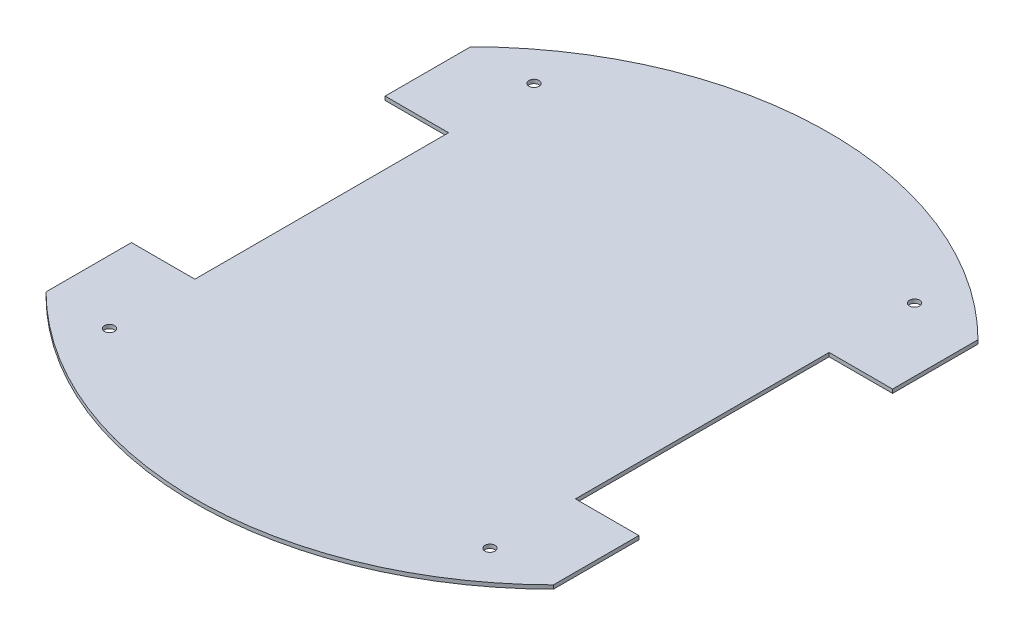
ISO-10303-21;
HEADER;
FILE_DESCRIPTION(('STEP AP214'),'2;1');
FILE_NAME('part.step','',(''),(''),'','','');
FILE_SCHEMA(('AUTOMOTIVE_DESIGN { 1 0 10303 214 1 1 1 1 }'));
ENDSEC;
DATA;
#1=APPLICATION_CONTEXT('core data for automotive mechanical design processes');
#2=APPLICATION_PROTOCOL_DEFINITION('international standard','automotive_design',2000,#1);
#3=PRODUCT_CONTEXT('',#1,'mechanical');
#4=PRODUCT('Part','Part','',(#3));
#5=PRODUCT_RELATED_PRODUCT_CATEGORY('part','',(#4));
#6=PRODUCT_DEFINITION_FORMATION('','',#4);
#7=PRODUCT_DEFINITION_CONTEXT('part definition',#1,'design');
#8=PRODUCT_DEFINITION('design','',#6,#7);
#9=PRODUCT_DEFINITION_SHAPE('','',#8);
#10=(LENGTH_UNIT() NAMED_UNIT(*) SI_UNIT(.MILLI.,.METRE.));
#11=(NAMED_UNIT(*) PLANE_ANGLE_UNIT() SI_UNIT($,.RADIAN.));
#12=(NAMED_UNIT(*) SI_UNIT($,.STERADIAN.) SOLID_ANGLE_UNIT());
#13=UNCERTAINTY_MEASURE_WITH_UNIT(LENGTH_MEASURE(1.E-05),#10,'distance_accuracy_value','');
#14=(GEOMETRIC_REPRESENTATION_CONTEXT(3) GLOBAL_UNCERTAINTY_ASSIGNED_CONTEXT((#13)) GLOBAL_UNIT_ASSIGNED_CONTEXT((#10,
#11,#12)) REPRESENTATION_CONTEXT('',''));
#15=CARTESIAN_POINT('',(0.,0.,0.));
#16=DIRECTION('',(0.,0.,1.));
#17=DIRECTION('',(1.,0.,0.));
#18=AXIS2_PLACEMENT_3D('',#15,#16,#17);
#19=CARTESIAN_POINT('',(-150.,3.,100.));
#20=DIRECTION('',(0.,0.,1.));
#21=DIRECTION('',(1.,0.,0.));
#22=AXIS2_PLACEMENT_3D('',#19,#20,#21);
#23=PLANE('',#22);
#24=DIRECTION('',(-1.,0.,0.));
#25=VECTOR('',#24,1.);
#26=CARTESIAN_POINT('',(-150.,0.,100.));
#27=LINE('',#26,#25);
#28=CARTESIAN_POINT('',(-150.,0.,100.));
#29=VERTEX_POINT('',#28);
#30=CARTESIAN_POINT('',(-200.,0.,100.));
#31=VERTEX_POINT('',#30);
#32=EDGE_CURVE('E154',#29,#31,#27,.T.);
#33=ORIENTED_EDGE('',*,*,#32,.T.);
#34=DIRECTION('',(0.,-1.,0.));
#35=VECTOR('',#34,1.);
#36=CARTESIAN_POINT('',(-200.,3.,100.));
#37=LINE('',#36,#35);
#38=CARTESIAN_POINT('',(-200.,3.,100.));
#39=VERTEX_POINT('',#38);
#40=EDGE_CURVE('E11',#39,#31,#37,.T.);
#41=ORIENTED_EDGE('',*,*,#40,.F.);
#42=DIRECTION('',(-1.,0.,0.));
#43=VECTOR('',#42,1.);
#44=CARTESIAN_POINT('',(-150.,3.,100.));
#45=LINE('',#44,#43);
#46=CARTESIAN_POINT('',(-150.,3.,100.));
#47=VERTEX_POINT('',#46);
#48=EDGE_CURVE('E176',#47,#39,#45,.T.);
#49=ORIENTED_EDGE('',*,*,#48,.F.);
#50=DIRECTION('',(0.,-1.,0.));
#51=VECTOR('',#50,1.);
#52=CARTESIAN_POINT('',(-150.,3.,100.));
#53=LINE('',#52,#51);
#54=EDGE_CURVE('E150',#47,#29,#53,.T.);
#55=ORIENTED_EDGE('',*,*,#54,.T.);
#56=EDGE_LOOP('',(#33,#41,#49,#55));
#57=FACE_BOUND('',#56,.T.);
#58=ADVANCED_FACE('F32',(#57),#23,.F.);
#59=CARTESIAN_POINT('',(-200.,3.,100.));
#60=DIRECTION('',(1.,0.,0.));
#61=DIRECTION('',(0.,0.,-1.));
#62=AXIS2_PLACEMENT_3D('',#59,#60,#61);
#63=PLANE('',#62);
#64=DIRECTION('',(0.,0.,1.));
#65=VECTOR('',#64,1.);
#66=CARTESIAN_POINT('',(-200.,0.,100.));
#67=LINE('',#66,#65);
#68=CARTESIAN_POINT('',(-200.,0.,167.359909646538));
#69=VERTEX_POINT('',#68);
#70=EDGE_CURVE('E157',#31,#69,#67,.T.);
#71=ORIENTED_EDGE('',*,*,#70,.T.);
#72=DIRECTION('',(0.,-1.,0.));
#73=VECTOR('',#72,1.);
#74=CARTESIAN_POINT('',(-200.,3.,167.359909646538));
#75=LINE('',#74,#73);
#76=CARTESIAN_POINT('',(-200.,3.,167.359909646538));
#77=VERTEX_POINT('',#76);
#78=EDGE_CURVE('E41',#77,#69,#75,.T.);
#79=ORIENTED_EDGE('',*,*,#78,.F.);
#80=DIRECTION('',(0.,0.,1.));
#81=VECTOR('',#80,1.);
#82=CARTESIAN_POINT('',(-200.,3.,100.));
#83=LINE('',#82,#81);
#84=EDGE_CURVE('E105',#39,#77,#83,.T.);
#85=ORIENTED_EDGE('',*,*,#84,.F.);
#86=ORIENTED_EDGE('',*,*,#40,.T.);
#87=EDGE_LOOP('',(#71,#79,#85,#86));
#88=FACE_BOUND('',#87,.T.);
#89=ADVANCED_FACE('F229',(#88),#63,.F.);
#90=CARTESIAN_POINT('',(0.,3.,-33.3333333333335));
#91=DIRECTION('',(0.,-1.,0.));
#92=DIRECTION('',(0.,0.,-1.));
#93=AXIS2_PLACEMENT_3D('',#90,#91,#92);
#94=CYLINDRICAL_SURFACE('',#93,283.333333333333);
#95=CARTESIAN_POINT('',(0.,0.,-33.3333333333335));
#96=DIRECTION('',(0.,1.,0.));
#97=DIRECTION('',(0.,0.,1.));
#98=AXIS2_PLACEMENT_3D('',#95,#96,#97);
#99=CIRCLE('',#98,283.333333333333);
#100=CARTESIAN_POINT('',(200.,0.,167.359909646538));
#101=VERTEX_POINT('',#100);
#102=EDGE_CURVE('E159',#69,#101,#99,.T.);
#103=ORIENTED_EDGE('',*,*,#102,.T.);
#104=DIRECTION('',(0.,-1.,0.));
#105=VECTOR('',#104,1.);
#106=CARTESIAN_POINT('',(200.,3.,167.359909646538));
#107=LINE('',#106,#105);
#108=CARTESIAN_POINT('',(200.,3.,167.359909646538));
#109=VERTEX_POINT('',#108);
#110=EDGE_CURVE('E195',#109,#101,#107,.T.);
#111=ORIENTED_EDGE('',*,*,#110,.F.);
#112=CARTESIAN_POINT('',(0.,3.,-33.3333333333335));
#113=DIRECTION('',(0.,1.,0.));
#114=DIRECTION('',(0.,0.,1.));
#115=AXIS2_PLACEMENT_3D('',#112,#113,#114);
#116=CIRCLE('',#115,283.333333333333);
#117=EDGE_CURVE('E244',#77,#109,#116,.T.);
#118=ORIENTED_EDGE('',*,*,#117,.F.);
#119=ORIENTED_EDGE('',*,*,#78,.T.);
#120=EDGE_LOOP('',(#103,#111,#118,#119));
#121=FACE_BOUND('',#120,.T.);
#122=ADVANCED_FACE('F234',(#121),#94,.T.);
#123=CARTESIAN_POINT('',(200.,3.,100.));
#124=DIRECTION('',(-1.,0.,0.));
#125=DIRECTION('',(0.,0.,1.));
#126=AXIS2_PLACEMENT_3D('',#123,#124,#125);
#127=PLANE('',#126);
#128=DIRECTION('',(0.,0.,-1.));
#129=VECTOR('',#128,1.);
#130=CARTESIAN_POINT('',(200.,0.,100.));
#131=LINE('',#130,#129);
#132=CARTESIAN_POINT('',(200.,0.,100.));
#133=VERTEX_POINT('',#132);
#134=EDGE_CURVE('E161',#101,#133,#131,.T.);
#135=ORIENTED_EDGE('',*,*,#134,.T.);
#136=DIRECTION('',(0.,-1.,0.));
#137=VECTOR('',#136,1.);
#138=CARTESIAN_POINT('',(200.,3.,100.));
#139=LINE('',#138,#137);
#140=CARTESIAN_POINT('',(200.,3.,100.));
#141=VERTEX_POINT('',#140);
#142=EDGE_CURVE('E192',#141,#133,#139,.T.);
#143=ORIENTED_EDGE('',*,*,#142,.F.);
#144=DIRECTION('',(0.,0.,-1.));
#145=VECTOR('',#144,1.);
#146=CARTESIAN_POINT('',(200.,3.,100.));
#147=LINE('',#146,#145);
#148=EDGE_CURVE('E246',#109,#141,#147,.T.);
#149=ORIENTED_EDGE('',*,*,#148,.F.);
#150=ORIENTED_EDGE('',*,*,#110,.T.);
#151=EDGE_LOOP('',(#135,#143,#149,#150));
#152=FACE_BOUND('',#151,.T.);
#153=ADVANCED_FACE('F284',(#152),#127,.F.);
#154=CARTESIAN_POINT('',(150.,3.,100.));
#155=DIRECTION('',(0.,0.,1.));
#156=DIRECTION('',(1.,0.,0.));
#157=AXIS2_PLACEMENT_3D('',#154,#155,#156);
#158=PLANE('',#157);
#159=DIRECTION('',(-1.,0.,0.));
#160=VECTOR('',#159,1.);
#161=CARTESIAN_POINT('',(150.,0.,100.));
#162=LINE('',#161,#160);
#163=CARTESIAN_POINT('',(150.,0.,100.));
#164=VERTEX_POINT('',#163);
#165=EDGE_CURVE('E163',#133,#164,#162,.T.);
#166=ORIENTED_EDGE('',*,*,#165,.T.);
#167=DIRECTION('',(0.,-1.,0.));
#168=VECTOR('',#167,1.);
#169=CARTESIAN_POINT('',(150.,3.,100.));
#170=LINE('',#169,#168);
#171=CARTESIAN_POINT('',(150.,3.,100.));
#172=VERTEX_POINT('',#171);
#173=EDGE_CURVE('E189',#172,#164,#170,.T.);
#174=ORIENTED_EDGE('',*,*,#173,.F.);
#175=DIRECTION('',(-1.,0.,0.));
#176=VECTOR('',#175,1.);
#177=CARTESIAN_POINT('',(150.,3.,100.));
#178=LINE('',#177,#176);
#179=EDGE_CURVE('E248',#141,#172,#178,.T.);
#180=ORIENTED_EDGE('',*,*,#179,.F.);
#181=ORIENTED_EDGE('',*,*,#142,.T.);
#182=EDGE_LOOP('',(#166,#174,#180,#181));
#183=FACE_BOUND('',#182,.T.);
#184=ADVANCED_FACE('F281',(#183),#158,.F.);
#185=CARTESIAN_POINT('',(150.,3.,100.));
#186=DIRECTION('',(-1.,0.,0.));
#187=DIRECTION('',(0.,0.,1.));
#188=AXIS2_PLACEMENT_3D('',#185,#186,#187);
#189=PLANE('',#188);
#190=DIRECTION('',(0.,0.,-1.));
#191=VECTOR('',#190,1.);
#192=CARTESIAN_POINT('',(150.,0.,100.));
#193=LINE('',#192,#191);
#194=CARTESIAN_POINT('',(150.,0.,-100.));
#195=VERTEX_POINT('',#194);
#196=EDGE_CURVE('E165',#164,#195,#193,.T.);
#197=ORIENTED_EDGE('',*,*,#196,.T.);
#198=DIRECTION('',(0.,-1.,0.));
#199=VECTOR('',#198,1.);
#200=CARTESIAN_POINT('',(150.,3.,-100.));
#201=LINE('',#200,#199);
#202=CARTESIAN_POINT('',(150.,3.,-100.));
#203=VERTEX_POINT('',#202);
#204=EDGE_CURVE('E186',#203,#195,#201,.T.);
#205=ORIENTED_EDGE('',*,*,#204,.F.);
#206=DIRECTION('',(0.,0.,-1.));
#207=VECTOR('',#206,1.);
#208=CARTESIAN_POINT('',(150.,3.,100.));
#209=LINE('',#208,#207);
#210=EDGE_CURVE('E254',#172,#203,#209,.T.);
#211=ORIENTED_EDGE('',*,*,#210,.F.);
#212=ORIENTED_EDGE('',*,*,#173,.T.);
#213=EDGE_LOOP('',(#197,#205,#211,#212));
#214=FACE_BOUND('',#213,.T.);
#215=ADVANCED_FACE('F277',(#214),#189,.F.);
#216=CARTESIAN_POINT('',(150.,3.,-100.));
#217=DIRECTION('',(0.,0.,-1.));
#218=DIRECTION('',(-1.,0.,0.));
#219=AXIS2_PLACEMENT_3D('',#216,#217,#218);
#220=PLANE('',#219);
#221=DIRECTION('',(1.,0.,0.));
#222=VECTOR('',#221,1.);
#223=CARTESIAN_POINT('',(150.,0.,-100.));
#224=LINE('',#223,#222);
#225=CARTESIAN_POINT('',(200.,0.,-100.));
#226=VERTEX_POINT('',#225);
#227=EDGE_CURVE('E167',#195,#226,#224,.T.);
#228=ORIENTED_EDGE('',*,*,#227,.T.);
#229=DIRECTION('',(0.,-1.,0.));
#230=VECTOR('',#229,1.);
#231=CARTESIAN_POINT('',(200.,3.,-100.));
#232=LINE('',#231,#230);
#233=CARTESIAN_POINT('',(200.,3.,-100.));
#234=VERTEX_POINT('',#233);
#235=EDGE_CURVE('E183',#234,#226,#232,.T.);
#236=ORIENTED_EDGE('',*,*,#235,.F.);
#237=DIRECTION('',(1.,0.,0.));
#238=VECTOR('',#237,1.);
#239=CARTESIAN_POINT('',(150.,3.,-100.));
#240=LINE('',#239,#238);
#241=EDGE_CURVE('E256',#203,#234,#240,.T.);
#242=ORIENTED_EDGE('',*,*,#241,.F.);
#243=ORIENTED_EDGE('',*,*,#204,.T.);
#244=EDGE_LOOP('',(#228,#236,#242,#243));
#245=FACE_BOUND('',#244,.T.);
#246=ADVANCED_FACE('F273',(#245),#220,.F.);
#247=CARTESIAN_POINT('',(200.,3.,-100.));
#248=DIRECTION('',(-1.,0.,0.));
#249=DIRECTION('',(0.,0.,1.));
#250=AXIS2_PLACEMENT_3D('',#247,#248,#249);
#251=PLANE('',#250);
#252=DIRECTION('',(0.,0.,-1.));
#253=VECTOR('',#252,1.);
#254=CARTESIAN_POINT('',(200.,0.,-100.));
#255=LINE('',#254,#253);
#256=CARTESIAN_POINT('',(200.,0.,-167.359909646538));
#257=VERTEX_POINT('',#256);
#258=EDGE_CURVE('E169',#226,#257,#255,.T.);
#259=ORIENTED_EDGE('',*,*,#258,.T.);
#260=DIRECTION('',(0.,-1.,0.));
#261=VECTOR('',#260,1.);
#262=CARTESIAN_POINT('',(200.,3.,-167.359909646538));
#263=LINE('',#262,#261);
#264=CARTESIAN_POINT('',(200.,3.,-167.359909646538));
#265=VERTEX_POINT('',#264);
#266=EDGE_CURVE('E180',#265,#257,#263,.T.);
#267=ORIENTED_EDGE('',*,*,#266,.F.);
#268=DIRECTION('',(0.,0.,-1.));
#269=VECTOR('',#268,1.);
#270=CARTESIAN_POINT('',(200.,3.,-100.));
#271=LINE('',#270,#269);
#272=EDGE_CURVE('E258',#234,#265,#271,.T.);
#273=ORIENTED_EDGE('',*,*,#272,.F.);
#274=ORIENTED_EDGE('',*,*,#235,.T.);
#275=EDGE_LOOP('',(#259,#267,#273,#274));
#276=FACE_BOUND('',#275,.T.);
#277=ADVANCED_FACE('F264',(#276),#251,.F.);
#278=CARTESIAN_POINT('',(0.,3.,33.3333333333337));
#279=DIRECTION('',(0.,-1.,0.));
#280=DIRECTION('',(0.,0.,-1.));
#281=AXIS2_PLACEMENT_3D('',#278,#279,#280);
#282=CYLINDRICAL_SURFACE('',#281,283.333333333333);
#283=CARTESIAN_POINT('',(0.,0.,33.3333333333337));
#284=DIRECTION('',(0.,1.,0.));
#285=DIRECTION('',(0.,0.,-1.));
#286=AXIS2_PLACEMENT_3D('',#283,#284,#285);
#287=CIRCLE('',#286,283.333333333333);
#288=CARTESIAN_POINT('',(-200.,0.,-167.359909646538));
#289=VERTEX_POINT('',#288);
#290=EDGE_CURVE('E171',#257,#289,#287,.T.);
#291=ORIENTED_EDGE('',*,*,#290,.T.);
#292=DIRECTION('',(0.,-1.,0.));
#293=VECTOR('',#292,1.);
#294=CARTESIAN_POINT('',(-200.,3.,-167.359909646538));
#295=LINE('',#294,#293);
#296=CARTESIAN_POINT('',(-200.,3.,-167.359909646538));
#297=VERTEX_POINT('',#296);
#298=EDGE_CURVE('E145',#297,#289,#295,.T.);
#299=ORIENTED_EDGE('',*,*,#298,.F.);
#300=CARTESIAN_POINT('',(0.,3.,33.3333333333337));
#301=DIRECTION('',(0.,1.,0.));
#302=DIRECTION('',(0.,0.,-1.));
#303=AXIS2_PLACEMENT_3D('',#300,#301,#302);
#304=CIRCLE('',#303,283.333333333333);
#305=EDGE_CURVE('E136',#265,#297,#304,.T.);
#306=ORIENTED_EDGE('',*,*,#305,.F.);
#307=ORIENTED_EDGE('',*,*,#266,.T.);
#308=EDGE_LOOP('',(#291,#299,#306,#307));
#309=FACE_BOUND('',#308,.T.);
#310=ADVANCED_FACE('F268',(#309),#282,.T.);
#311=CARTESIAN_POINT('',(-200.,3.,-100.));
#312=DIRECTION('',(1.,0.,0.));
#313=DIRECTION('',(0.,0.,-1.));
#314=AXIS2_PLACEMENT_3D('',#311,#312,#313);
#315=PLANE('',#314);
#316=DIRECTION('',(0.,0.,1.));
#317=VECTOR('',#316,1.);
#318=CARTESIAN_POINT('',(-200.,0.,-100.));
#319=LINE('',#318,#317);
#320=CARTESIAN_POINT('',(-200.,0.,-100.));
#321=VERTEX_POINT('',#320);
#322=EDGE_CURVE('E144',#289,#321,#319,.T.);
#323=ORIENTED_EDGE('',*,*,#322,.T.);
#324=DIRECTION('',(0.,-1.,0.));
#325=VECTOR('',#324,1.);
#326=CARTESIAN_POINT('',(-200.,3.,-100.));
#327=LINE('',#326,#325);
#328=CARTESIAN_POINT('',(-200.,3.,-100.));
#329=VERTEX_POINT('',#328);
#330=EDGE_CURVE('E141',#329,#321,#327,.T.);
#331=ORIENTED_EDGE('',*,*,#330,.F.);
#332=DIRECTION('',(0.,0.,1.));
#333=VECTOR('',#332,1.);
#334=CARTESIAN_POINT('',(-200.,3.,-100.));
#335=LINE('',#334,#333);
#336=EDGE_CURVE('E130',#297,#329,#335,.T.);
#337=ORIENTED_EDGE('',*,*,#336,.F.);
#338=ORIENTED_EDGE('',*,*,#298,.T.);
#339=EDGE_LOOP('',(#323,#331,#337,#338));
#340=FACE_BOUND('',#339,.T.);
#341=ADVANCED_FACE('F142',(#340),#315,.F.);
#342=CARTESIAN_POINT('',(-150.,3.,-100.));
#343=DIRECTION('',(0.,0.,-1.));
#344=DIRECTION('',(-1.,0.,0.));
#345=AXIS2_PLACEMENT_3D('',#342,#343,#344);
#346=PLANE('',#345);
#347=DIRECTION('',(1.,0.,0.));
#348=VECTOR('',#347,1.);
#349=CARTESIAN_POINT('',(-150.,0.,-100.));
#350=LINE('',#349,#348);
#351=CARTESIAN_POINT('',(-150.,0.,-100.));
#352=VERTEX_POINT('',#351);
#353=EDGE_CURVE('E91',#321,#352,#350,.T.);
#354=ORIENTED_EDGE('',*,*,#353,.T.);
#355=DIRECTION('',(0.,-1.,0.));
#356=VECTOR('',#355,1.);
#357=CARTESIAN_POINT('',(-150.,3.,-100.));
#358=LINE('',#357,#356);
#359=CARTESIAN_POINT('',(-150.,3.,-100.));
#360=VERTEX_POINT('',#359);
#361=EDGE_CURVE('E146',#360,#352,#358,.T.);
#362=ORIENTED_EDGE('',*,*,#361,.F.);
#363=DIRECTION('',(1.,0.,0.));
#364=VECTOR('',#363,1.);
#365=CARTESIAN_POINT('',(-150.,3.,-100.));
#366=LINE('',#365,#364);
#367=EDGE_CURVE('E134',#329,#360,#366,.T.);
#368=ORIENTED_EDGE('',*,*,#367,.F.);
#369=ORIENTED_EDGE('',*,*,#330,.T.);
#370=EDGE_LOOP('',(#354,#362,#368,#369));
#371=FACE_BOUND('',#370,.T.);
#372=ADVANCED_FACE('F148',(#371),#346,.F.);
#373=CARTESIAN_POINT('',(-150.,3.,-100.));
#374=DIRECTION('',(1.,0.,0.));
#375=DIRECTION('',(0.,0.,-1.));
#376=AXIS2_PLACEMENT_3D('',#373,#374,#375);
#377=PLANE('',#376);
#378=DIRECTION('',(0.,0.,1.));
#379=VECTOR('',#378,1.);
#380=CARTESIAN_POINT('',(-150.,0.,-100.));
#381=LINE('',#380,#379);
#382=EDGE_CURVE('E97',#352,#29,#381,.T.);
#383=ORIENTED_EDGE('',*,*,#382,.T.);
#384=ORIENTED_EDGE('',*,*,#54,.F.);
#385=DIRECTION('',(0.,0.,1.));
#386=VECTOR('',#385,1.);
#387=CARTESIAN_POINT('',(-150.,3.,-100.));
#388=LINE('',#387,#386);
#389=EDGE_CURVE('E50',#360,#47,#388,.T.);
#390=ORIENTED_EDGE('',*,*,#389,.F.);
#391=ORIENTED_EDGE('',*,*,#361,.T.);
#392=EDGE_LOOP('',(#383,#384,#390,#391));
#393=FACE_BOUND('',#392,.T.);
#394=ADVANCED_FACE('F306',(#393),#377,.F.);
#395=CARTESIAN_POINT('',(0.,3.,-33.3333333333335));
#396=DIRECTION('',(0.,1.,0.));
#397=DIRECTION('',(0.,0.,1.));
#398=AXIS2_PLACEMENT_3D('',#395,#396,#397);
#399=PLANE('',#398);
#400=CARTESIAN_POINT('',(-150.,3.,167.359909646538));
#401=DIRECTION('',(0.,1.,0.));
#402=DIRECTION('',(0.,0.,-1.));
#403=AXIS2_PLACEMENT_3D('',#400,#401,#402);
#404=CIRCLE('',#403,3.99999999999999);
#405=CARTESIAN_POINT('',(-150.,3.,163.359909646538));
#406=VERTEX_POINT('',#405);
#407=EDGE_CURVE('E333',#406,#406,#404,.T.);
#408=ORIENTED_EDGE('',*,*,#407,.F.);
#409=EDGE_LOOP('',(#408));
#410=FACE_BOUND('',#409,.T.);
#411=CARTESIAN_POINT('',(150.,3.,167.359909646538));
#412=DIRECTION('',(0.,1.,0.));
#413=DIRECTION('',(0.,0.,1.));
#414=AXIS2_PLACEMENT_3D('',#411,#412,#413);
#415=CIRCLE('',#414,3.99999999999999);
#416=CARTESIAN_POINT('',(150.,3.,171.359909646538));
#417=VERTEX_POINT('',#416);
#418=EDGE_CURVE('E330',#417,#417,#415,.T.);
#419=ORIENTED_EDGE('',*,*,#418,.F.);
#420=EDGE_LOOP('',(#419));
#421=FACE_BOUND('',#420,.T.);
#422=CARTESIAN_POINT('',(150.,3.,-167.359909646538));
#423=DIRECTION('',(0.,1.,0.));
#424=DIRECTION('',(0.,0.,-1.));
#425=AXIS2_PLACEMENT_3D('',#422,#423,#424);
#426=CIRCLE('',#425,3.99999999999999);
#427=CARTESIAN_POINT('',(150.,3.,-171.359909646538));
#428=VERTEX_POINT('',#427);
#429=EDGE_CURVE('E327',#428,#428,#426,.T.);
#430=ORIENTED_EDGE('',*,*,#429,.F.);
#431=EDGE_LOOP('',(#430));
#432=FACE_BOUND('',#431,.T.);
#433=CARTESIAN_POINT('',(-150.,3.,-167.359909646538));
#434=DIRECTION('',(0.,1.,0.));
#435=DIRECTION('',(0.,0.,1.));
#436=AXIS2_PLACEMENT_3D('',#433,#434,#435);
#437=CIRCLE('',#436,3.99999999999999);
#438=CARTESIAN_POINT('',(-150.,3.,-163.359909646538));
#439=VERTEX_POINT('',#438);
#440=EDGE_CURVE('E204',#439,#439,#437,.T.);
#441=ORIENTED_EDGE('',*,*,#440,.F.);
#442=EDGE_LOOP('',(#441));
#443=FACE_BOUND('',#442,.T.);
#444=ORIENTED_EDGE('',*,*,#48,.T.);
#445=ORIENTED_EDGE('',*,*,#84,.T.);
#446=ORIENTED_EDGE('',*,*,#117,.T.);
#447=ORIENTED_EDGE('',*,*,#148,.T.);
#448=ORIENTED_EDGE('',*,*,#179,.T.);
#449=ORIENTED_EDGE('',*,*,#210,.T.);
#450=ORIENTED_EDGE('',*,*,#241,.T.);
#451=ORIENTED_EDGE('',*,*,#272,.T.);
#452=ORIENTED_EDGE('',*,*,#305,.T.);
#453=ORIENTED_EDGE('',*,*,#336,.T.);
#454=ORIENTED_EDGE('',*,*,#367,.T.);
#455=ORIENTED_EDGE('',*,*,#389,.T.);
#456=EDGE_LOOP('',(#444,#445,#446,#447,#448,#449,#450,#451,#452,#453,#454,#455));
#457=FACE_BOUND('',#456,.T.);
#458=ADVANCED_FACE('F132',(#410,#421,#432,#443,#457),#399,.T.);
#459=CARTESIAN_POINT('',(0.,0.,-33.3333333333335));
#460=DIRECTION('',(0.,1.,0.));
#461=DIRECTION('',(0.,0.,1.));
#462=AXIS2_PLACEMENT_3D('',#459,#460,#461);
#463=PLANE('',#462);
#464=CARTESIAN_POINT('',(-150.,0.,167.359909646538));
#465=DIRECTION('',(0.,1.,0.));
#466=DIRECTION('',(0.,0.,1.));
#467=AXIS2_PLACEMENT_3D('',#464,#465,#466);
#468=CIRCLE('',#467,3.99999999999999);
#469=CARTESIAN_POINT('',(-150.,0.,171.359909646538));
#470=VERTEX_POINT('',#469);
#471=EDGE_CURVE('E35',#470,#470,#468,.T.);
#472=ORIENTED_EDGE('',*,*,#471,.T.);
#473=EDGE_LOOP('',(#472));
#474=FACE_BOUND('',#473,.T.);
#475=CARTESIAN_POINT('',(150.,0.,167.359909646538));
#476=DIRECTION('',(0.,1.,0.));
#477=DIRECTION('',(0.,0.,1.));
#478=AXIS2_PLACEMENT_3D('',#475,#476,#477);
#479=CIRCLE('',#478,3.99999999999999);
#480=CARTESIAN_POINT('',(150.,0.,171.359909646538));
#481=VERTEX_POINT('',#480);
#482=EDGE_CURVE('E206',#481,#481,#479,.T.);
#483=ORIENTED_EDGE('',*,*,#482,.T.);
#484=EDGE_LOOP('',(#483));
#485=FACE_BOUND('',#484,.T.);
#486=CARTESIAN_POINT('',(150.,0.,-167.359909646538));
#487=DIRECTION('',(0.,1.,0.));
#488=DIRECTION('',(0.,0.,1.));
#489=AXIS2_PLACEMENT_3D('',#486,#487,#488);
#490=CIRCLE('',#489,3.99999999999999);
#491=CARTESIAN_POINT('',(150.,0.,-163.359909646538));
#492=VERTEX_POINT('',#491);
#493=EDGE_CURVE('E203',#492,#492,#490,.T.);
#494=ORIENTED_EDGE('',*,*,#493,.T.);
#495=EDGE_LOOP('',(#494));
#496=FACE_BOUND('',#495,.T.);
#497=CARTESIAN_POINT('',(-150.,0.,-167.359909646538));
#498=DIRECTION('',(0.,1.,0.));
#499=DIRECTION('',(0.,0.,1.));
#500=AXIS2_PLACEMENT_3D('',#497,#498,#499);
#501=CIRCLE('',#500,3.99999999999999);
#502=CARTESIAN_POINT('',(-150.,0.,-163.359909646538));
#503=VERTEX_POINT('',#502);
#504=EDGE_CURVE('E200',#503,#503,#501,.T.);
#505=ORIENTED_EDGE('',*,*,#504,.T.);
#506=EDGE_LOOP('',(#505));
#507=FACE_BOUND('',#506,.T.);
#508=ORIENTED_EDGE('',*,*,#32,.F.);
#509=ORIENTED_EDGE('',*,*,#382,.F.);
#510=ORIENTED_EDGE('',*,*,#353,.F.);
#511=ORIENTED_EDGE('',*,*,#322,.F.);
#512=ORIENTED_EDGE('',*,*,#290,.F.);
#513=ORIENTED_EDGE('',*,*,#258,.F.);
#514=ORIENTED_EDGE('',*,*,#227,.F.);
#515=ORIENTED_EDGE('',*,*,#196,.F.);
#516=ORIENTED_EDGE('',*,*,#165,.F.);
#517=ORIENTED_EDGE('',*,*,#134,.F.);
#518=ORIENTED_EDGE('',*,*,#102,.F.);
#519=ORIENTED_EDGE('',*,*,#70,.F.);
#520=EDGE_LOOP('',(#508,#509,#510,#511,#512,#513,#514,#515,#516,#517,#518,#519));
#521=FACE_BOUND('',#520,.T.);
#522=ADVANCED_FACE('F213',(#474,#485,#496,#507,#521),#463,.F.);
#523=CARTESIAN_POINT('',(-150.,-7.,-167.359909646538));
#524=DIRECTION('',(0.,1.,0.));
#525=DIRECTION('',(0.,0.,1.));
#526=AXIS2_PLACEMENT_3D('',#523,#524,#525);
#527=CYLINDRICAL_SURFACE('',#526,3.99999999999999);
#528=ORIENTED_EDGE('',*,*,#440,.T.);
#529=EDGE_LOOP('',(#528));
#530=FACE_BOUND('',#529,.T.);
#531=ORIENTED_EDGE('',*,*,#504,.F.);
#532=EDGE_LOOP('',(#531));
#533=FACE_BOUND('',#532,.T.);
#534=ADVANCED_FACE('F311',(#530,#533),#527,.F.);
#535=CARTESIAN_POINT('',(150.,-7.,-167.359909646538));
#536=DIRECTION('',(0.,1.,0.));
#537=DIRECTION('',(0.,0.,1.));
#538=AXIS2_PLACEMENT_3D('',#535,#536,#537);
#539=CYLINDRICAL_SURFACE('',#538,3.99999999999999);
#540=ORIENTED_EDGE('',*,*,#429,.T.);
#541=EDGE_LOOP('',(#540));
#542=FACE_BOUND('',#541,.T.);
#543=ORIENTED_EDGE('',*,*,#493,.F.);
#544=EDGE_LOOP('',(#543));
#545=FACE_BOUND('',#544,.T.);
#546=ADVANCED_FACE('F223',(#542,#545),#539,.F.);
#547=CARTESIAN_POINT('',(150.,-7.,167.359909646538));
#548=DIRECTION('',(0.,1.,0.));
#549=DIRECTION('',(0.,0.,1.));
#550=AXIS2_PLACEMENT_3D('',#547,#548,#549);
#551=CYLINDRICAL_SURFACE('',#550,3.99999999999999);
#552=ORIENTED_EDGE('',*,*,#418,.T.);
#553=EDGE_LOOP('',(#552));
#554=FACE_BOUND('',#553,.T.);
#555=ORIENTED_EDGE('',*,*,#482,.F.);
#556=EDGE_LOOP('',(#555));
#557=FACE_BOUND('',#556,.T.);
#558=ADVANCED_FACE('F217',(#554,#557),#551,.F.);
#559=CARTESIAN_POINT('',(-150.,-7.,167.359909646538));
#560=DIRECTION('',(0.,1.,0.));
#561=DIRECTION('',(0.,0.,1.));
#562=AXIS2_PLACEMENT_3D('',#559,#560,#561);
#563=CYLINDRICAL_SURFACE('',#562,3.99999999999999);
#564=ORIENTED_EDGE('',*,*,#407,.T.);
#565=EDGE_LOOP('',(#564));
#566=FACE_BOUND('',#565,.T.);
#567=ORIENTED_EDGE('',*,*,#471,.F.);
#568=EDGE_LOOP('',(#567));
#569=FACE_BOUND('',#568,.T.);
#570=ADVANCED_FACE('F215',(#566,#569),#563,.F.);
#571=CLOSED_SHELL('',(#58,#89,#122,#153,#184,#215,#246,#277,#310,#341,#372,#394,#458,#522,#534,
#546,#558,#570));
#572=MANIFOLD_SOLID_BREP('B2',#571);
#573=ADVANCED_BREP_SHAPE_REPRESENTATION('',(#18,#572),#14);
#574=SHAPE_DEFINITION_REPRESENTATION(#9,#573);
ENDSEC;
END-ISO-10303-21;
